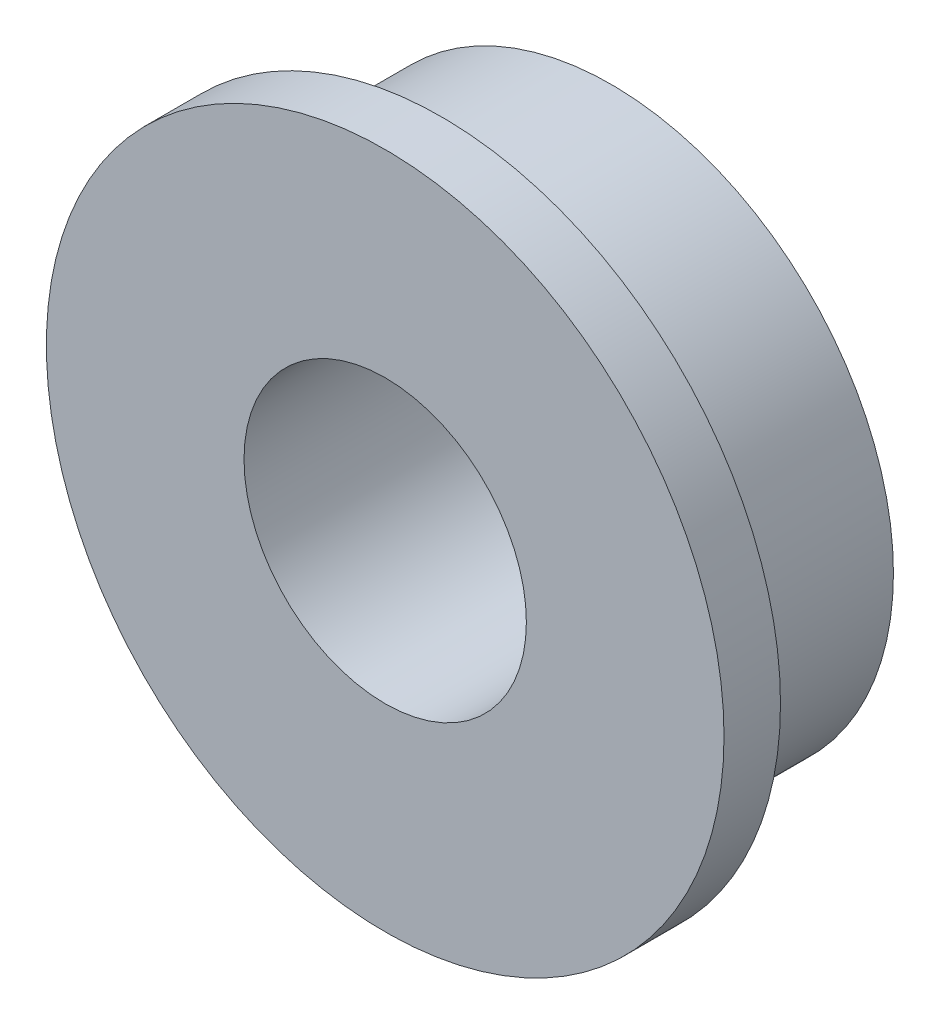
ISO-10303-21;
HEADER;
FILE_DESCRIPTION(('STEP AP214'),'2;1');
FILE_NAME('part.step','',(''),(''),'','','');
FILE_SCHEMA(('AUTOMOTIVE_DESIGN { 1 0 10303 214 1 1 1 1 }'));
ENDSEC;
DATA;
#1=APPLICATION_CONTEXT('core data for automotive mechanical design processes');
#2=APPLICATION_PROTOCOL_DEFINITION('international standard','automotive_design',2000,#1);
#3=PRODUCT_CONTEXT('',#1,'mechanical');
#4=PRODUCT('Part','Part','',(#3));
#5=PRODUCT_RELATED_PRODUCT_CATEGORY('part','',(#4));
#6=PRODUCT_DEFINITION_FORMATION('','',#4);
#7=PRODUCT_DEFINITION_CONTEXT('part definition',#1,'design');
#8=PRODUCT_DEFINITION('design','',#6,#7);
#9=PRODUCT_DEFINITION_SHAPE('','',#8);
#10=(LENGTH_UNIT() NAMED_UNIT(*) SI_UNIT(.MILLI.,.METRE.));
#11=(NAMED_UNIT(*) PLANE_ANGLE_UNIT() SI_UNIT($,.RADIAN.));
#12=(NAMED_UNIT(*) SI_UNIT($,.STERADIAN.) SOLID_ANGLE_UNIT());
#13=UNCERTAINTY_MEASURE_WITH_UNIT(LENGTH_MEASURE(1.E-05),#10,'distance_accuracy_value','');
#14=(GEOMETRIC_REPRESENTATION_CONTEXT(3) GLOBAL_UNCERTAINTY_ASSIGNED_CONTEXT((#13)) GLOBAL_UNIT_ASSIGNED_CONTEXT((#10,
#11,#12)) REPRESENTATION_CONTEXT('',''));
#15=CARTESIAN_POINT('',(0.,0.,0.));
#16=DIRECTION('',(0.,0.,1.));
#17=DIRECTION('',(1.,0.,0.));
#18=AXIS2_PLACEMENT_3D('',#15,#16,#17);
#19=CARTESIAN_POINT('',(0.,0.,4.));
#20=DIRECTION('',(0.,0.,-1.));
#21=DIRECTION('',(-1.,0.,0.));
#22=AXIS2_PLACEMENT_3D('',#19,#20,#21);
#23=CYLINDRICAL_SURFACE('',#22,5.);
#24=CARTESIAN_POINT('',(0.,0.,0.));
#25=DIRECTION('',(0.,0.,1.));
#26=DIRECTION('',(1.,0.,0.));
#27=AXIS2_PLACEMENT_3D('',#24,#25,#26);
#28=CIRCLE('',#27,5.);
#29=CARTESIAN_POINT('',(5.,0.,0.));
#30=VERTEX_POINT('',#29);
#31=EDGE_CURVE('E34',#30,#30,#28,.T.);
#32=ORIENTED_EDGE('',*,*,#31,.T.);
#33=EDGE_LOOP('',(#32));
#34=FACE_BOUND('',#33,.T.);
#35=CARTESIAN_POINT('',(0.,0.,3.));
#36=DIRECTION('',(0.,0.,1.));
#37=DIRECTION('',(1.,0.,0.));
#38=AXIS2_PLACEMENT_3D('',#35,#36,#37);
#39=CIRCLE('',#38,5.);
#40=CARTESIAN_POINT('',(5.,0.,3.));
#41=VERTEX_POINT('',#40);
#42=EDGE_CURVE('E10',#41,#41,#39,.T.);
#43=ORIENTED_EDGE('',*,*,#42,.F.);
#44=EDGE_LOOP('',(#43));
#45=FACE_BOUND('',#44,.T.);
#46=ADVANCED_FACE('F31',(#34,#45),#23,.T.);
#47=CARTESIAN_POINT('',(0.,0.,4.));
#48=DIRECTION('',(0.,0.,1.));
#49=DIRECTION('',(1.,0.,0.));
#50=AXIS2_PLACEMENT_3D('',#47,#48,#49);
#51=PLANE('',#50);
#52=CARTESIAN_POINT('',(0.,0.,4.));
#53=DIRECTION('',(0.,0.,1.));
#54=DIRECTION('',(1.,0.,0.));
#55=AXIS2_PLACEMENT_3D('',#52,#53,#54);
#56=CIRCLE('',#55,2.5);
#57=CARTESIAN_POINT('',(2.5,0.,4.));
#58=VERTEX_POINT('',#57);
#59=EDGE_CURVE('E42',#58,#58,#56,.T.);
#60=ORIENTED_EDGE('',*,*,#59,.F.);
#61=EDGE_LOOP('',(#60));
#62=FACE_BOUND('',#61,.T.);
#63=CARTESIAN_POINT('',(0.,0.,4.));
#64=DIRECTION('',(0.,0.,1.));
#65=DIRECTION('',(1.,0.,0.));
#66=AXIS2_PLACEMENT_3D('',#63,#64,#65);
#67=CIRCLE('',#66,6.);
#68=CARTESIAN_POINT('',(6.,0.,4.));
#69=VERTEX_POINT('',#68);
#70=EDGE_CURVE('E45',#69,#69,#67,.T.);
#71=ORIENTED_EDGE('',*,*,#70,.T.);
#72=EDGE_LOOP('',(#71));
#73=FACE_BOUND('',#72,.T.);
#74=ADVANCED_FACE('F59',(#62,#73),#51,.T.);
#75=CARTESIAN_POINT('',(0.,0.,0.));
#76=DIRECTION('',(0.,0.,1.));
#77=DIRECTION('',(1.,0.,0.));
#78=AXIS2_PLACEMENT_3D('',#75,#76,#77);
#79=PLANE('',#78);
#80=ORIENTED_EDGE('',*,*,#31,.F.);
#81=EDGE_LOOP('',(#80));
#82=FACE_BOUND('',#81,.T.);
#83=CARTESIAN_POINT('',(0.,0.,0.));
#84=DIRECTION('',(0.,0.,1.));
#85=DIRECTION('',(1.,0.,0.));
#86=AXIS2_PLACEMENT_3D('',#83,#84,#85);
#87=CIRCLE('',#86,2.5);
#88=CARTESIAN_POINT('',(2.5,0.,0.));
#89=VERTEX_POINT('',#88);
#90=EDGE_CURVE('E48',#89,#89,#87,.T.);
#91=ORIENTED_EDGE('',*,*,#90,.T.);
#92=EDGE_LOOP('',(#91));
#93=FACE_BOUND('',#92,.T.);
#94=ADVANCED_FACE('F77',(#82,#93),#79,.F.);
#95=CARTESIAN_POINT('',(0.,0.,4.));
#96=DIRECTION('',(0.,0.,-1.));
#97=DIRECTION('',(-1.,0.,0.));
#98=AXIS2_PLACEMENT_3D('',#95,#96,#97);
#99=CYLINDRICAL_SURFACE('',#98,2.5);
#100=ORIENTED_EDGE('',*,*,#59,.T.);
#101=EDGE_LOOP('',(#100));
#102=FACE_BOUND('',#101,.T.);
#103=ORIENTED_EDGE('',*,*,#90,.F.);
#104=EDGE_LOOP('',(#103));
#105=FACE_BOUND('',#104,.T.);
#106=ADVANCED_FACE('F68',(#102,#105),#99,.F.);
#107=CARTESIAN_POINT('',(0.,0.,3.));
#108=DIRECTION('',(0.,0.,1.));
#109=DIRECTION('',(1.,0.,0.));
#110=AXIS2_PLACEMENT_3D('',#107,#108,#109);
#111=PLANE('',#110);
#112=CARTESIAN_POINT('',(0.,0.,3.));
#113=DIRECTION('',(0.,0.,1.));
#114=DIRECTION('',(1.,0.,0.));
#115=AXIS2_PLACEMENT_3D('',#112,#113,#114);
#116=CIRCLE('',#115,6.);
#117=CARTESIAN_POINT('',(6.,0.,3.));
#118=VERTEX_POINT('',#117);
#119=EDGE_CURVE('E50',#118,#118,#116,.T.);
#120=ORIENTED_EDGE('',*,*,#119,.F.);
#121=EDGE_LOOP('',(#120));
#122=FACE_BOUND('',#121,.T.);
#123=ORIENTED_EDGE('',*,*,#42,.T.);
#124=EDGE_LOOP('',(#123));
#125=FACE_BOUND('',#124,.T.);
#126=ADVANCED_FACE('F63',(#122,#125),#111,.F.);
#127=CARTESIAN_POINT('',(0.,0.,3.));
#128=DIRECTION('',(0.,0.,1.));
#129=DIRECTION('',(1.,0.,0.));
#130=AXIS2_PLACEMENT_3D('',#127,#128,#129);
#131=CYLINDRICAL_SURFACE('',#130,6.);
#132=ORIENTED_EDGE('',*,*,#119,.T.);
#133=EDGE_LOOP('',(#132));
#134=FACE_BOUND('',#133,.T.);
#135=ORIENTED_EDGE('',*,*,#70,.F.);
#136=EDGE_LOOP('',(#135));
#137=FACE_BOUND('',#136,.T.);
#138=ADVANCED_FACE('F61',(#134,#137),#131,.T.);
#139=CLOSED_SHELL('',(#46,#74,#94,#106,#126,#138));
#140=MANIFOLD_SOLID_BREP('B2',#139);
#141=ADVANCED_BREP_SHAPE_REPRESENTATION('',(#18,#140),#14);
#142=SHAPE_DEFINITION_REPRESENTATION(#9,#141);
ENDSEC;
END-ISO-10303-21;
